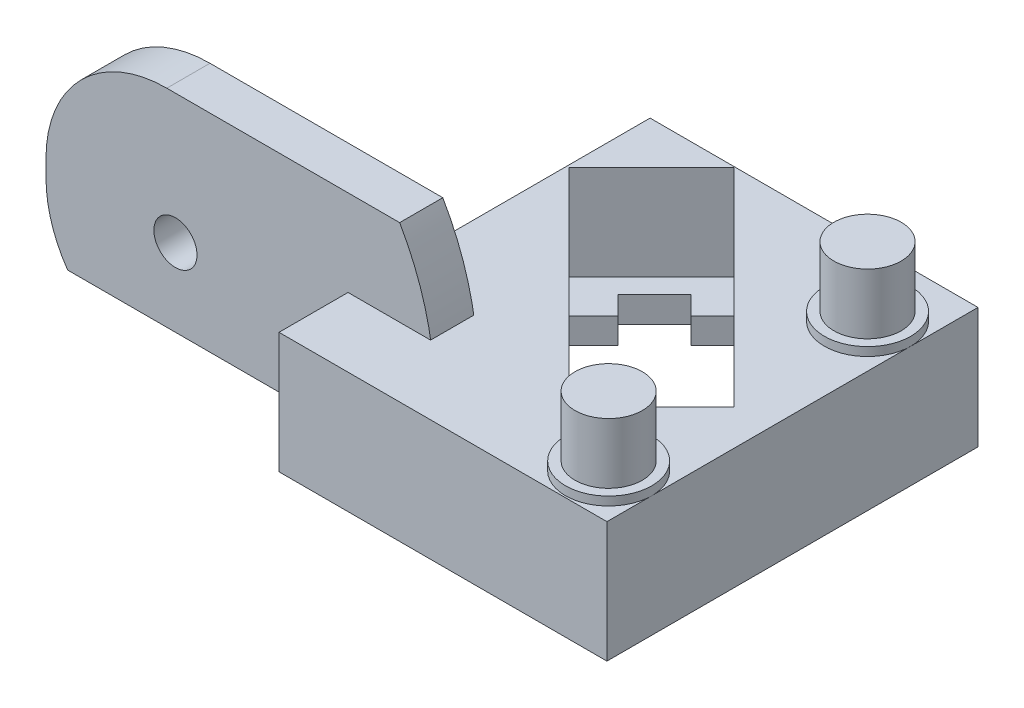
ISO-10303-21;
HEADER;
FILE_DESCRIPTION(('STEP AP214'),'2;1');
FILE_NAME('part.step','',(''),(''),'','','');
FILE_SCHEMA(('AUTOMOTIVE_DESIGN { 1 0 10303 214 1 1 1 1 }'));
ENDSEC;
DATA;
#1=APPLICATION_CONTEXT('core data for automotive mechanical design processes');
#2=APPLICATION_PROTOCOL_DEFINITION('international standard','automotive_design',2000,#1);
#3=PRODUCT_CONTEXT('',#1,'mechanical');
#4=PRODUCT('Part','Part','',(#3));
#5=PRODUCT_RELATED_PRODUCT_CATEGORY('part','',(#4));
#6=PRODUCT_DEFINITION_FORMATION('','',#4);
#7=PRODUCT_DEFINITION_CONTEXT('part definition',#1,'design');
#8=PRODUCT_DEFINITION('design','',#6,#7);
#9=PRODUCT_DEFINITION_SHAPE('','',#8);
#10=(LENGTH_UNIT() NAMED_UNIT(*) SI_UNIT(.MILLI.,.METRE.));
#11=(NAMED_UNIT(*) PLANE_ANGLE_UNIT() SI_UNIT($,.RADIAN.));
#12=(NAMED_UNIT(*) SI_UNIT($,.STERADIAN.) SOLID_ANGLE_UNIT());
#13=UNCERTAINTY_MEASURE_WITH_UNIT(LENGTH_MEASURE(1.E-05),#10,'distance_accuracy_value','');
#14=(GEOMETRIC_REPRESENTATION_CONTEXT(3) GLOBAL_UNCERTAINTY_ASSIGNED_CONTEXT((#13)) GLOBAL_UNIT_ASSIGNED_CONTEXT((#10,
#11,#12)) REPRESENTATION_CONTEXT('',''));
#15=CARTESIAN_POINT('',(0.,0.,0.));
#16=DIRECTION('',(0.,0.,1.));
#17=DIRECTION('',(1.,0.,0.));
#18=AXIS2_PLACEMENT_3D('',#15,#16,#17);
#19=CARTESIAN_POINT('',(0.,0.,5.));
#20=DIRECTION('',(0.,0.,1.));
#21=DIRECTION('',(1.,0.,0.));
#22=AXIS2_PLACEMENT_3D('',#19,#20,#21);
#23=PLANE('',#22);
#24=CARTESIAN_POINT('',(0.,0.,5.));
#25=DIRECTION('',(0.,0.,-1.));
#26=DIRECTION('',(1.,0.,0.));
#27=AXIS2_PLACEMENT_3D('',#24,#25,#26);
#28=CIRCLE('',#27,2.5);
#29=CARTESIAN_POINT('',(-2.5,0.,5.));
#30=VERTEX_POINT('',#29);
#31=EDGE_CURVE('P0_E26',#30,#30,#28,.T.);
#32=ORIENTED_EDGE('',*,*,#31,.T.);
#33=EDGE_LOOP('',(#32));
#34=FACE_BOUND('',#33,.T.);
#35=DIRECTION('',(1.,0.,0.));
#36=VECTOR('',#35,1.);
#37=CARTESIAN_POINT('',(-6.24456275548431,-9.00000013411045,5.));
#38=LINE('',#37,#36);
#39=CARTESIAN_POINT('',(-12.4891255109686,-9.00000013411045,5.));
#40=VERTEX_POINT('',#39);
#41=CARTESIAN_POINT('',(28.6181760003326,-9.00000013411045,5.));
#42=VERTEX_POINT('',#41);
#43=EDGE_CURVE('P0_E171',#40,#42,#38,.T.);
#44=ORIENTED_EDGE('',*,*,#43,.T.);
#45=CARTESIAN_POINT('',(0.,0.,5.));
#46=DIRECTION('',(0.,0.,1.));
#47=DIRECTION('',(1.,0.,0.));
#48=AXIS2_PLACEMENT_3D('',#45,#46,#47);
#49=CIRCLE('',#48,30.);
#50=CARTESIAN_POINT('',(25.9807621135332,15.,5.));
#51=VERTEX_POINT('',#50);
#52=EDGE_CURVE('P0_E92',#42,#51,#49,.T.);
#53=ORIENTED_EDGE('',*,*,#52,.T.);
#54=DIRECTION('',(-1.,0.,0.));
#55=VECTOR('',#54,1.);
#56=CARTESIAN_POINT('',(12.9903810567666,15.,5.));
#57=LINE('',#56,#55);
#58=CARTESIAN_POINT('',(-1.,15.,5.));
#59=VERTEX_POINT('',#58);
#60=EDGE_CURVE('P0_E85',#51,#59,#57,.T.);
#61=ORIENTED_EDGE('',*,*,#60,.T.);
#62=CARTESIAN_POINT('',(-1.,1.,5.));
#63=DIRECTION('',(0.,0.,-1.));
#64=DIRECTION('',(-0.707106781186548,0.707106781186547,0.));
#65=AXIS2_PLACEMENT_3D('',#62,#63,#64);
#66=CIRCLE('',#65,14.);
#67=CARTESIAN_POINT('',(-15.,1.,5.));
#68=VERTEX_POINT('',#67);
#69=EDGE_CURVE('P0_E89',#68,#59,#66,.T.);
#70=ORIENTED_EDGE('',*,*,#69,.F.);
#71=DIRECTION('',(0.,-1.,0.));
#72=VECTOR('',#71,1.);
#73=CARTESIAN_POINT('',(-15.,7.5,5.));
#74=LINE('',#73,#72);
#75=CARTESIAN_POINT('',(-15.,-1.00000044703483,5.));
#76=VERTEX_POINT('',#75);
#77=EDGE_CURVE('P0_E78',#68,#76,#74,.T.);
#78=ORIENTED_EDGE('',*,*,#77,.T.);
#79=CARTESIAN_POINT('',(-1.,-1.00000044703483,5.));
#80=DIRECTION('',(0.,0.,-1.));
#81=DIRECTION('',(-0.707106781186548,-0.707106781186548,0.));
#82=AXIS2_PLACEMENT_3D('',#79,#80,#81);
#83=CIRCLE('',#82,14.);
#84=EDGE_CURVE('P0_E124',#40,#76,#83,.T.);
#85=ORIENTED_EDGE('',*,*,#84,.F.);
#86=EDGE_LOOP('',(#44,#53,#61,#70,#78,#85));
#87=FACE_BOUND('',#86,.T.);
#88=ADVANCED_FACE('P0_F17',(#34,#87),#23,.T.);
#89=CARTESIAN_POINT('',(0.,0.,0.));
#90=DIRECTION('',(0.,0.,1.));
#91=DIRECTION('',(1.,0.,0.));
#92=AXIS2_PLACEMENT_3D('',#89,#90,#91);
#93=CYLINDRICAL_SURFACE('',#92,2.5);
#94=ORIENTED_EDGE('',*,*,#31,.F.);
#95=DIRECTION('',(0.,0.,-1.));
#96=VECTOR('',#95,1.);
#97=CARTESIAN_POINT('',(-2.5,0.,0.));
#98=LINE('',#97,#96);
#99=CARTESIAN_POINT('',(-2.5,0.,0.));
#100=VERTEX_POINT('',#99);
#101=EDGE_CURVE('P0_E11',#30,#100,#98,.T.);
#102=ORIENTED_EDGE('',*,*,#101,.T.);
#103=CARTESIAN_POINT('',(0.,0.,0.));
#104=DIRECTION('',(0.,0.,-1.));
#105=DIRECTION('',(1.,0.,0.));
#106=AXIS2_PLACEMENT_3D('',#103,#104,#105);
#107=CIRCLE('',#106,2.5);
#108=EDGE_CURVE('P0_E125',#100,#100,#107,.T.);
#109=ORIENTED_EDGE('',*,*,#108,.T.);
#110=ORIENTED_EDGE('',*,*,#101,.F.);
#111=EDGE_LOOP('',(#94,#102,#109,#110));
#112=FACE_BOUND('',#111,.T.);
#113=ADVANCED_FACE('P0_F140',(#112),#93,.F.);
#114=CARTESIAN_POINT('',(0.,0.,0.));
#115=DIRECTION('',(0.,0.,1.));
#116=DIRECTION('',(1.,0.,0.));
#117=AXIS2_PLACEMENT_3D('',#114,#115,#116);
#118=CYLINDRICAL_SURFACE('',#117,30.);
#119=DIRECTION('',(0.,0.,-1.));
#120=VECTOR('',#119,1.);
#121=CARTESIAN_POINT('',(28.6181760003326,-9.00000013411045,0.));
#122=LINE('',#121,#120);
#123=CARTESIAN_POINT('',(28.6181760003326,-9.00000013411045,0.));
#124=VERTEX_POINT('',#123);
#125=EDGE_CURVE('P0_E166',#42,#124,#122,.T.);
#126=ORIENTED_EDGE('',*,*,#125,.T.);
#127=CARTESIAN_POINT('',(0.,0.,0.));
#128=DIRECTION('',(0.,0.,1.));
#129=DIRECTION('',(1.,0.,0.));
#130=AXIS2_PLACEMENT_3D('',#127,#128,#129);
#131=CIRCLE('',#130,30.);
#132=CARTESIAN_POINT('',(25.9807621135332,15.,0.));
#133=VERTEX_POINT('',#132);
#134=EDGE_CURVE('P0_E120',#124,#133,#131,.T.);
#135=ORIENTED_EDGE('',*,*,#134,.T.);
#136=DIRECTION('',(0.,0.,1.));
#137=VECTOR('',#136,1.);
#138=CARTESIAN_POINT('',(25.9807621135332,15.,0.));
#139=LINE('',#138,#137);
#140=EDGE_CURVE('P0_E96',#133,#51,#139,.T.);
#141=ORIENTED_EDGE('',*,*,#140,.T.);
#142=ORIENTED_EDGE('',*,*,#52,.F.);
#143=EDGE_LOOP('',(#126,#135,#141,#142));
#144=FACE_BOUND('',#143,.T.);
#145=ADVANCED_FACE('P0_F194',(#144),#118,.T.);
#146=CARTESIAN_POINT('',(-15.,15.,5.));
#147=DIRECTION('',(1.,0.,0.));
#148=DIRECTION('',(0.,1.,0.));
#149=AXIS2_PLACEMENT_3D('',#146,#147,#148);
#150=PLANE('',#149);
#151=DIRECTION('',(0.,0.,-1.));
#152=VECTOR('',#151,1.);
#153=CARTESIAN_POINT('',(-15.,-1.00000044703483,5.));
#154=LINE('',#153,#152);
#155=CARTESIAN_POINT('',(-15.,-1.00000044703483,0.));
#156=VERTEX_POINT('',#155);
#157=EDGE_CURVE('P0_E116',#76,#156,#154,.T.);
#158=ORIENTED_EDGE('',*,*,#157,.F.);
#159=ORIENTED_EDGE('',*,*,#77,.F.);
#160=DIRECTION('',(0.,0.,1.));
#161=VECTOR('',#160,1.);
#162=CARTESIAN_POINT('',(-15.,1.,5.));
#163=LINE('',#162,#161);
#164=CARTESIAN_POINT('',(-15.,1.,0.));
#165=VERTEX_POINT('',#164);
#166=EDGE_CURVE('P0_E109',#165,#68,#163,.T.);
#167=ORIENTED_EDGE('',*,*,#166,.F.);
#168=DIRECTION('',(0.,1.,0.));
#169=VECTOR('',#168,1.);
#170=CARTESIAN_POINT('',(-15.,7.5,0.));
#171=LINE('',#170,#169);
#172=EDGE_CURVE('P0_E177',#156,#165,#171,.T.);
#173=ORIENTED_EDGE('',*,*,#172,.F.);
#174=EDGE_LOOP('',(#158,#159,#167,#173));
#175=FACE_BOUND('',#174,.T.);
#176=ADVANCED_FACE('P0_F219',(#175),#150,.F.);
#177=CARTESIAN_POINT('',(25.9807621135332,15.,5.));
#178=DIRECTION('',(0.,-1.,0.));
#179=DIRECTION('',(0.,0.,-1.));
#180=AXIS2_PLACEMENT_3D('',#177,#178,#179);
#181=PLANE('',#180);
#182=DIRECTION('',(0.,0.,-1.));
#183=VECTOR('',#182,1.);
#184=CARTESIAN_POINT('',(-1.,15.,5.));
#185=LINE('',#184,#183);
#186=CARTESIAN_POINT('',(-1.,15.,0.));
#187=VERTEX_POINT('',#186);
#188=EDGE_CURVE('P0_E97',#59,#187,#185,.T.);
#189=ORIENTED_EDGE('',*,*,#188,.F.);
#190=ORIENTED_EDGE('',*,*,#60,.F.);
#191=ORIENTED_EDGE('',*,*,#140,.F.);
#192=DIRECTION('',(1.,0.,0.));
#193=VECTOR('',#192,1.);
#194=CARTESIAN_POINT('',(12.9903810567666,15.,0.));
#195=LINE('',#194,#193);
#196=EDGE_CURVE('P0_E102',#187,#133,#195,.T.);
#197=ORIENTED_EDGE('',*,*,#196,.F.);
#198=EDGE_LOOP('',(#189,#190,#191,#197));
#199=FACE_BOUND('',#198,.T.);
#200=ADVANCED_FACE('P0_F100',(#199),#181,.F.);
#201=CARTESIAN_POINT('',(-1.,1.,5.));
#202=DIRECTION('',(0.,0.,-1.));
#203=DIRECTION('',(-0.707106781186548,0.707106781186547,0.));
#204=AXIS2_PLACEMENT_3D('',#201,#202,#203);
#205=CYLINDRICAL_SURFACE('',#204,14.);
#206=CARTESIAN_POINT('',(-1.,1.,0.));
#207=DIRECTION('',(0.,0.,1.));
#208=DIRECTION('',(-0.707106781186548,0.707106781186547,0.));
#209=AXIS2_PLACEMENT_3D('',#206,#207,#208);
#210=CIRCLE('',#209,14.);
#211=EDGE_CURVE('P0_E180',#187,#165,#210,.T.);
#212=ORIENTED_EDGE('',*,*,#211,.T.);
#213=ORIENTED_EDGE('',*,*,#166,.T.);
#214=ORIENTED_EDGE('',*,*,#69,.T.);
#215=ORIENTED_EDGE('',*,*,#188,.T.);
#216=EDGE_LOOP('',(#212,#213,#214,#215));
#217=FACE_BOUND('',#216,.T.);
#218=ADVANCED_FACE('P0_F108',(#217),#205,.T.);
#219=CARTESIAN_POINT('',(-1.,-1.00000044703483,5.));
#220=DIRECTION('',(0.,0.,-1.));
#221=DIRECTION('',(-0.707106781186548,-0.707106781186548,0.));
#222=AXIS2_PLACEMENT_3D('',#219,#220,#221);
#223=CYLINDRICAL_SURFACE('',#222,14.);
#224=DIRECTION('',(0.,0.,1.));
#225=VECTOR('',#224,1.);
#226=CARTESIAN_POINT('',(-12.4891255109686,-9.00000013411045,5.));
#227=LINE('',#226,#225);
#228=CARTESIAN_POINT('',(-12.4891255109686,-9.00000013411045,0.));
#229=VERTEX_POINT('',#228);
#230=EDGE_CURVE('P0_E176',#229,#40,#227,.T.);
#231=ORIENTED_EDGE('',*,*,#230,.T.);
#232=ORIENTED_EDGE('',*,*,#84,.T.);
#233=ORIENTED_EDGE('',*,*,#157,.T.);
#234=CARTESIAN_POINT('',(-1.,-1.00000044703483,0.));
#235=DIRECTION('',(0.,0.,1.));
#236=DIRECTION('',(-0.707106781186548,-0.707106781186548,0.));
#237=AXIS2_PLACEMENT_3D('',#234,#235,#236);
#238=CIRCLE('',#237,14.);
#239=EDGE_CURVE('P0_E157',#156,#229,#238,.T.);
#240=ORIENTED_EDGE('',*,*,#239,.T.);
#241=EDGE_LOOP('',(#231,#232,#233,#240));
#242=FACE_BOUND('',#241,.T.);
#243=ADVANCED_FACE('P0_F147',(#242),#223,.T.);
#244=CARTESIAN_POINT('',(0.,0.,0.));
#245=DIRECTION('',(0.,0.,1.));
#246=DIRECTION('',(1.,0.,0.));
#247=AXIS2_PLACEMENT_3D('',#244,#245,#246);
#248=PLANE('',#247);
#249=ORIENTED_EDGE('',*,*,#108,.F.);
#250=EDGE_LOOP('',(#249));
#251=FACE_BOUND('',#250,.T.);
#252=DIRECTION('',(-1.,0.,0.));
#253=VECTOR('',#252,1.);
#254=CARTESIAN_POINT('',(-6.24456275548431,-9.00000013411045,0.));
#255=LINE('',#254,#253);
#256=EDGE_CURVE('P0_E154',#124,#229,#255,.T.);
#257=ORIENTED_EDGE('',*,*,#256,.T.);
#258=ORIENTED_EDGE('',*,*,#239,.F.);
#259=ORIENTED_EDGE('',*,*,#172,.T.);
#260=ORIENTED_EDGE('',*,*,#211,.F.);
#261=ORIENTED_EDGE('',*,*,#196,.T.);
#262=ORIENTED_EDGE('',*,*,#134,.F.);
#263=EDGE_LOOP('',(#257,#258,#259,#260,#261,#262));
#264=FACE_BOUND('',#263,.T.);
#265=ADVANCED_FACE('P0_F143',(#251,#264),#248,.F.);
#266=CARTESIAN_POINT('',(-12.4891255109686,-9.00000013411045,5.));
#267=DIRECTION('',(0.,1.,0.));
#268=DIRECTION('',(1.,0.,0.));
#269=AXIS2_PLACEMENT_3D('',#266,#267,#268);
#270=PLANE('',#269);
#271=ORIENTED_EDGE('',*,*,#256,.F.);
#272=ORIENTED_EDGE('',*,*,#125,.F.);
#273=ORIENTED_EDGE('',*,*,#43,.F.);
#274=ORIENTED_EDGE('',*,*,#230,.F.);
#275=EDGE_LOOP('',(#271,#272,#273,#274));
#276=FACE_BOUND('',#275,.T.);
#277=ADVANCED_FACE('P0_F146',(#276),#270,.F.);
#278=CLOSED_SHELL('',(#88,#113,#145,#176,#200,#218,#243,#265,#277));
#279=MANIFOLD_SOLID_BREP('P0_B1',#278);
#280=CARTESIAN_POINT('',(20.,-2.,-8.5));
#281=DIRECTION('',(1.,0.,0.));
#282=DIRECTION('',(0.,1.,0.));
#283=AXIS2_PLACEMENT_3D('',#280,#281,#282);
#284=PLANE('',#283);
#285=DIRECTION('',(0.,0.,1.));
#286=VECTOR('',#285,1.);
#287=CARTESIAN_POINT('',(20.,5.,5.));
#288=LINE('',#287,#286);
#289=CARTESIAN_POINT('',(20.,5.,-30.));
#290=VERTEX_POINT('',#289);
#291=CARTESIAN_POINT('',(20.,5.,13.));
#292=VERTEX_POINT('',#291);
#293=EDGE_CURVE('P1_E221',#290,#292,#288,.T.);
#294=ORIENTED_EDGE('',*,*,#293,.F.);
#295=DIRECTION('',(0.,-1.,0.));
#296=VECTOR('',#295,1.);
#297=CARTESIAN_POINT('',(20.,5.,-30.));
#298=LINE('',#297,#296);
#299=CARTESIAN_POINT('',(20.,-9.,-30.));
#300=VERTEX_POINT('',#299);
#301=EDGE_CURVE('P1_E318',#290,#300,#298,.T.);
#302=ORIENTED_EDGE('',*,*,#301,.T.);
#303=DIRECTION('',(0.,0.,-1.));
#304=VECTOR('',#303,1.);
#305=CARTESIAN_POINT('',(20.,-9.,13.));
#306=LINE('',#305,#304);
#307=CARTESIAN_POINT('',(20.,-9.,13.));
#308=VERTEX_POINT('',#307);
#309=EDGE_CURVE('P1_E324',#308,#300,#306,.T.);
#310=ORIENTED_EDGE('',*,*,#309,.F.);
#311=DIRECTION('',(0.,-1.,0.));
#312=VECTOR('',#311,1.);
#313=CARTESIAN_POINT('',(20.,5.,13.));
#314=LINE('',#313,#312);
#315=EDGE_CURVE('P1_E19',#292,#308,#314,.T.);
#316=ORIENTED_EDGE('',*,*,#315,.F.);
#317=EDGE_LOOP('',(#294,#302,#310,#316));
#318=FACE_BOUND('',#317,.T.);
#319=ADVANCED_FACE('P1_F16',(#318),#284,.F.);
#320=CARTESIAN_POINT('',(58.,-2.,-8.5));
#321=DIRECTION('',(1.,0.,0.));
#322=DIRECTION('',(0.,1.,0.));
#323=AXIS2_PLACEMENT_3D('',#320,#321,#322);
#324=PLANE('',#323);
#325=DIRECTION('',(0.,0.,1.));
#326=VECTOR('',#325,1.);
#327=CARTESIAN_POINT('',(58.,5.,5.));
#328=LINE('',#327,#326);
#329=CARTESIAN_POINT('',(58.,5.,-30.));
#330=VERTEX_POINT('',#329);
#331=CARTESIAN_POINT('',(58.,5.,-22.2));
#332=VERTEX_POINT('',#331);
#333=EDGE_CURVE('P1_E213',#330,#332,#328,.T.);
#334=ORIENTED_EDGE('',*,*,#333,.T.);
#335=DIRECTION('',(0.,0.,1.));
#336=VECTOR('',#335,1.);
#337=CARTESIAN_POINT('',(58.,5.,5.));
#338=LINE('',#337,#336);
#339=CARTESIAN_POINT('',(58.,5.,13.));
#340=VERTEX_POINT('',#339);
#341=EDGE_CURVE('P1_E210',#332,#340,#338,.T.);
#342=ORIENTED_EDGE('',*,*,#341,.T.);
#343=DIRECTION('',(0.,-1.,0.));
#344=VECTOR('',#343,1.);
#345=CARTESIAN_POINT('',(58.,5.,13.));
#346=LINE('',#345,#344);
#347=CARTESIAN_POINT('',(58.,-9.,13.));
#348=VERTEX_POINT('',#347);
#349=EDGE_CURVE('P1_E10',#340,#348,#346,.T.);
#350=ORIENTED_EDGE('',*,*,#349,.T.);
#351=DIRECTION('',(0.,0.,-1.));
#352=VECTOR('',#351,1.);
#353=CARTESIAN_POINT('',(58.,-9.,13.));
#354=LINE('',#353,#352);
#355=CARTESIAN_POINT('',(58.,-9.,-30.));
#356=VERTEX_POINT('',#355);
#357=EDGE_CURVE('P1_E332',#348,#356,#354,.T.);
#358=ORIENTED_EDGE('',*,*,#357,.T.);
#359=DIRECTION('',(0.,1.,0.));
#360=VECTOR('',#359,1.);
#361=CARTESIAN_POINT('',(58.,5.,-30.));
#362=LINE('',#361,#360);
#363=EDGE_CURVE('P1_E321',#356,#330,#362,.T.);
#364=ORIENTED_EDGE('',*,*,#363,.T.);
#365=EDGE_LOOP('',(#334,#342,#350,#358,#364));
#366=FACE_BOUND('',#365,.T.);
#367=ADVANCED_FACE('P1_F211',(#366),#324,.T.);
#368=CARTESIAN_POINT('',(20.,5.,13.));
#369=DIRECTION('',(0.,0.,1.));
#370=DIRECTION('',(1.,0.,0.));
#371=AXIS2_PLACEMENT_3D('',#368,#369,#370);
#372=PLANE('',#371);
#373=ORIENTED_EDGE('',*,*,#315,.T.);
#374=DIRECTION('',(1.,0.,0.));
#375=VECTOR('',#374,1.);
#376=CARTESIAN_POINT('',(20.,-9.,13.));
#377=LINE('',#376,#375);
#378=EDGE_CURVE('P1_E205',#308,#348,#377,.T.);
#379=ORIENTED_EDGE('',*,*,#378,.T.);
#380=ORIENTED_EDGE('',*,*,#349,.F.);
#381=DIRECTION('',(1.,0.,0.));
#382=VECTOR('',#381,1.);
#383=CARTESIAN_POINT('',(20.,5.,13.));
#384=LINE('',#383,#382);
#385=EDGE_CURVE('P1_E202',#292,#340,#384,.T.);
#386=ORIENTED_EDGE('',*,*,#385,.F.);
#387=EDGE_LOOP('',(#373,#379,#380,#386));
#388=FACE_BOUND('',#387,.T.);
#389=ADVANCED_FACE('P1_F200',(#388),#372,.T.);
#390=CARTESIAN_POINT('',(20.,-9.,-30.));
#391=DIRECTION('',(0.,0.,-1.));
#392=DIRECTION('',(0.,-1.,0.));
#393=AXIS2_PLACEMENT_3D('',#390,#391,#392);
#394=PLANE('',#393);
#395=ORIENTED_EDGE('',*,*,#301,.F.);
#396=DIRECTION('',(1.,0.,0.));
#397=VECTOR('',#396,1.);
#398=CARTESIAN_POINT('',(20.,5.,-30.));
#399=LINE('',#398,#397);
#400=EDGE_CURVE('P1_E236',#290,#330,#399,.T.);
#401=ORIENTED_EDGE('',*,*,#400,.T.);
#402=ORIENTED_EDGE('',*,*,#363,.F.);
#403=DIRECTION('',(1.,0.,0.));
#404=VECTOR('',#403,1.);
#405=CARTESIAN_POINT('',(20.,-9.,-30.));
#406=LINE('',#405,#404);
#407=EDGE_CURVE('P1_E328',#300,#356,#406,.T.);
#408=ORIENTED_EDGE('',*,*,#407,.F.);
#409=EDGE_LOOP('',(#395,#401,#402,#408));
#410=FACE_BOUND('',#409,.T.);
#411=ADVANCED_FACE('P1_F385',(#410),#394,.T.);
#412=CARTESIAN_POINT('',(53.8492424049175,5.,-5.86648634762061));
#413=DIRECTION('',(0.707106781186548,0.,0.707106781186547));
#414=DIRECTION('',(0.,-1.,0.));
#415=AXIS2_PLACEMENT_3D('',#412,#413,#414);
#416=PLANE('',#415);
#417=DIRECTION('',(-0.707106781186547,0.,0.707106781186548));
#418=VECTOR('',#417,1.);
#419=CARTESIAN_POINT('',(51.420310216783,5.,-3.43755415948608));
#420=LINE('',#419,#418);
#421=CARTESIAN_POINT('',(53.8492424049175,5.,-5.86648634762061));
#422=VERTEX_POINT('',#421);
#423=CARTESIAN_POINT('',(44.3033008588991,5.,3.67945519839781));
#424=VERTEX_POINT('',#423);
#425=EDGE_CURVE('P1_E235',#422,#424,#420,.T.);
#426=ORIENTED_EDGE('',*,*,#425,.F.);
#427=DIRECTION('',(0.,-1.,0.));
#428=VECTOR('',#427,1.);
#429=CARTESIAN_POINT('',(53.8492424049175,5.,-5.86648634762061));
#430=LINE('',#429,#428);
#431=CARTESIAN_POINT('',(53.8492424049175,-6.,-5.86648634762061));
#432=VERTEX_POINT('',#431);
#433=EDGE_CURVE('P1_E268',#422,#432,#430,.T.);
#434=ORIENTED_EDGE('',*,*,#433,.T.);
#435=DIRECTION('',(-0.707106781186547,0.,0.707106781186548));
#436=VECTOR('',#435,1.);
#437=CARTESIAN_POINT('',(53.8492424049175,-6.,-5.86648634762061));
#438=LINE('',#437,#436);
#439=CARTESIAN_POINT('',(44.3033008588991,-6.,3.67945519839781));
#440=VERTEX_POINT('',#439);
#441=EDGE_CURVE('P1_E313',#432,#440,#438,.T.);
#442=ORIENTED_EDGE('',*,*,#441,.T.);
#443=DIRECTION('',(0.,-1.,0.));
#444=VECTOR('',#443,1.);
#445=CARTESIAN_POINT('',(44.3033008588991,5.,3.67945519839781));
#446=LINE('',#445,#444);
#447=EDGE_CURVE('P1_E267',#424,#440,#446,.T.);
#448=ORIENTED_EDGE('',*,*,#447,.F.);
#449=EDGE_LOOP('',(#426,#434,#442,#448));
#450=FACE_BOUND('',#449,.T.);
#451=ADVANCED_FACE('P1_F703',(#450),#416,.F.);
#452=CARTESIAN_POINT('',(44.3033008588991,5.,3.67945519839781));
#453=DIRECTION('',(-0.707106781186547,0.,0.707106781186548));
#454=DIRECTION('',(0.,1.,0.));
#455=AXIS2_PLACEMENT_3D('',#452,#453,#454);
#456=PLANE('',#455);
#457=DIRECTION('',(-0.707106781186548,0.,-0.707106781186547));
#458=VECTOR('',#457,1.);
#459=CARTESIAN_POINT('',(29.8076118445749,5.,-10.8162338159264));
#460=LINE('',#459,#458);
#461=CARTESIAN_POINT('',(20.2616702985565,5.,-20.3621753619448));
#462=VERTEX_POINT('',#461);
#463=EDGE_CURVE('P1_E239',#424,#462,#460,.T.);
#464=ORIENTED_EDGE('',*,*,#463,.F.);
#465=ORIENTED_EDGE('',*,*,#447,.T.);
#466=DIRECTION('',(-0.707106781186548,0.,-0.707106781186547));
#467=VECTOR('',#466,1.);
#468=CARTESIAN_POINT('',(44.3033008588991,-6.,3.67945519839781));
#469=LINE('',#468,#467);
#470=CARTESIAN_POINT('',(40.4142135623731,-6.,-0.209632098128192));
#471=VERTEX_POINT('',#470);
#472=EDGE_CURVE('P1_E310',#440,#471,#469,.T.);
#473=ORIENTED_EDGE('',*,*,#472,.T.);
#474=DIRECTION('',(0.,-1.,0.));
#475=VECTOR('',#474,1.);
#476=CARTESIAN_POINT('',(40.4142135623731,-6.,-0.209632098128192));
#477=LINE('',#476,#475);
#478=CARTESIAN_POINT('',(40.4142135623731,-9.,-0.209632098128192));
#479=VERTEX_POINT('',#478);
#480=EDGE_CURVE('P1_E274',#471,#479,#477,.T.);
#481=ORIENTED_EDGE('',*,*,#480,.T.);
#482=DIRECTION('',(0.707106781186548,0.,0.707106781186547));
#483=VECTOR('',#482,1.);
#484=CARTESIAN_POINT('',(38.6130681963119,-9.,-2.01077746418943));
#485=LINE('',#484,#483);
#486=CARTESIAN_POINT('',(24.1507575950825,-9.,-16.4730880654188));
#487=VERTEX_POINT('',#486);
#488=EDGE_CURVE('P1_E301',#487,#479,#485,.T.);
#489=ORIENTED_EDGE('',*,*,#488,.F.);
#490=DIRECTION('',(0.,-1.,0.));
#491=VECTOR('',#490,1.);
#492=CARTESIAN_POINT('',(24.1507575950825,-6.,-16.4730880654188));
#493=LINE('',#492,#491);
#494=CARTESIAN_POINT('',(24.1507575950825,-6.,-16.4730880654188));
#495=VERTEX_POINT('',#494);
#496=EDGE_CURVE('P1_E346',#495,#487,#493,.T.);
#497=ORIENTED_EDGE('',*,*,#496,.F.);
#498=DIRECTION('',(-0.707106781186548,0.,-0.707106781186547));
#499=VECTOR('',#498,1.);
#500=CARTESIAN_POINT('',(44.3033008588991,-6.,3.67945519839781));
#501=LINE('',#500,#499);
#502=CARTESIAN_POINT('',(20.2616702985565,-6.,-20.3621753619448));
#503=VERTEX_POINT('',#502);
#504=EDGE_CURVE('P1_E252',#495,#503,#501,.T.);
#505=ORIENTED_EDGE('',*,*,#504,.T.);
#506=DIRECTION('',(0.,-1.,0.));
#507=VECTOR('',#506,1.);
#508=CARTESIAN_POINT('',(20.2616702985565,5.,-20.3621753619448));
#509=LINE('',#508,#507);
#510=EDGE_CURVE('P1_E37',#462,#503,#509,.T.);
#511=ORIENTED_EDGE('',*,*,#510,.F.);
#512=EDGE_LOOP('',(#464,#465,#473,#481,#489,#497,#505,#511));
#513=FACE_BOUND('',#512,.T.);
#514=ADVANCED_FACE('P1_F706',(#513),#456,.F.);
#515=CARTESIAN_POINT('',(20.2616702985565,5.,-20.3621753619448));
#516=DIRECTION('',(-0.707106781186547,0.,-0.707106781186548));
#517=DIRECTION('',(-0.707106781186548,0.,0.707106781186547));
#518=AXIS2_PLACEMENT_3D('',#515,#516,#517);
#519=PLANE('',#518);
#520=DIRECTION('',(0.707106781186548,0.,-0.707106781186547));
#521=VECTOR('',#520,1.);
#522=CARTESIAN_POINT('',(22.6057088834312,5.,-22.7062139468195));
#523=LINE('',#522,#521);
#524=CARTESIAN_POINT('',(29.8076118445749,5.,-29.9081169079632));
#525=VERTEX_POINT('',#524);
#526=EDGE_CURVE('P1_E244',#462,#525,#523,.T.);
#527=ORIENTED_EDGE('',*,*,#526,.F.);
#528=ORIENTED_EDGE('',*,*,#510,.T.);
#529=DIRECTION('',(0.707106781186548,0.,-0.707106781186547));
#530=VECTOR('',#529,1.);
#531=CARTESIAN_POINT('',(20.2616702985565,-6.,-20.3621753619448));
#532=LINE('',#531,#530);
#533=CARTESIAN_POINT('',(29.8076118445749,-6.,-29.9081169079632));
#534=VERTEX_POINT('',#533);
#535=EDGE_CURVE('P1_E249',#503,#534,#532,.T.);
#536=ORIENTED_EDGE('',*,*,#535,.T.);
#537=DIRECTION('',(0.,-1.,0.));
#538=VECTOR('',#537,1.);
#539=CARTESIAN_POINT('',(29.8076118445749,5.,-29.9081169079632));
#540=LINE('',#539,#538);
#541=EDGE_CURVE('P1_E47',#525,#534,#540,.T.);
#542=ORIENTED_EDGE('',*,*,#541,.F.);
#543=EDGE_LOOP('',(#527,#528,#536,#542));
#544=FACE_BOUND('',#543,.T.);
#545=ADVANCED_FACE('P1_F710',(#544),#519,.F.);
#546=CARTESIAN_POINT('',(29.8076118445749,5.,-29.9081169079632));
#547=DIRECTION('',(0.707106781186547,0.,-0.707106781186548));
#548=DIRECTION('',(0.,-1.,0.));
#549=AXIS2_PLACEMENT_3D('',#546,#547,#548);
#550=PLANE('',#549);
#551=DIRECTION('',(0.707106781186548,0.,0.707106781186547));
#552=VECTOR('',#551,1.);
#553=CARTESIAN_POINT('',(27.332738110422,5.,-32.3829906421161));
#554=LINE('',#553,#552);
#555=EDGE_CURVE('P1_E231',#525,#422,#554,.T.);
#556=ORIENTED_EDGE('',*,*,#555,.F.);
#557=ORIENTED_EDGE('',*,*,#541,.T.);
#558=DIRECTION('',(0.707106781186548,0.,0.707106781186547));
#559=VECTOR('',#558,1.);
#560=CARTESIAN_POINT('',(29.8076118445749,-6.,-29.9081169079632));
#561=LINE('',#560,#559);
#562=CARTESIAN_POINT('',(33.6966991411009,-6.,-26.0190296114372));
#563=VERTEX_POINT('',#562);
#564=EDGE_CURVE('P1_E253',#534,#563,#561,.T.);
#565=ORIENTED_EDGE('',*,*,#564,.T.);
#566=DIRECTION('',(0.,-1.,0.));
#567=VECTOR('',#566,1.);
#568=CARTESIAN_POINT('',(33.6966991411009,-6.,-26.0190296114372));
#569=LINE('',#568,#567);
#570=CARTESIAN_POINT('',(33.6966991411009,-9.,-26.0190296114372));
#571=VERTEX_POINT('',#570);
#572=EDGE_CURVE('P1_E277',#563,#571,#569,.T.);
#573=ORIENTED_EDGE('',*,*,#572,.T.);
#574=DIRECTION('',(-0.707106781186548,0.,-0.707106781186547));
#575=VECTOR('',#574,1.);
#576=CARTESIAN_POINT('',(40.027281758685,-9.,-19.6884469938531));
#577=LINE('',#576,#575);
#578=CARTESIAN_POINT('',(49.9601551083915,-9.,-9.75557364414661));
#579=VERTEX_POINT('',#578);
#580=EDGE_CURVE('P1_E287',#579,#571,#577,.T.);
#581=ORIENTED_EDGE('',*,*,#580,.F.);
#582=DIRECTION('',(0.,-1.,0.));
#583=VECTOR('',#582,1.);
#584=CARTESIAN_POINT('',(49.9601551083915,-6.,-9.75557364414661));
#585=LINE('',#584,#583);
#586=CARTESIAN_POINT('',(49.9601551083915,-6.,-9.75557364414661));
#587=VERTEX_POINT('',#586);
#588=EDGE_CURVE('P1_E278',#587,#579,#585,.T.);
#589=ORIENTED_EDGE('',*,*,#588,.F.);
#590=DIRECTION('',(0.707106781186548,0.,0.707106781186547));
#591=VECTOR('',#590,1.);
#592=CARTESIAN_POINT('',(29.8076118445749,-6.,-29.9081169079632));
#593=LINE('',#592,#591);
#594=EDGE_CURVE('P1_E363',#587,#432,#593,.T.);
#595=ORIENTED_EDGE('',*,*,#594,.T.);
#596=ORIENTED_EDGE('',*,*,#433,.F.);
#597=EDGE_LOOP('',(#556,#557,#565,#573,#581,#589,#595,#596));
#598=FACE_BOUND('',#597,.T.);
#599=ADVANCED_FACE('P1_F455',(#598),#550,.F.);
#600=CARTESIAN_POINT('',(37.055456351737,-6.,-13.1143308547827));
#601=DIRECTION('',(0.,-1.,0.));
#602=DIRECTION('',(0.,0.,-1.));
#603=AXIS2_PLACEMENT_3D('',#600,#601,#602);
#604=PLANE('',#603);
#605=DIRECTION('',(0.707106781186548,0.,0.707106781186548));
#606=VECTOR('',#605,1.);
#607=CARTESIAN_POINT('',(34.2270292269908,-6.,-20.5389520572415));
#608=LINE('',#607,#606);
#609=CARTESIAN_POINT('',(29.1005050633884,-6.,-25.6654762208439));
#610=VERTEX_POINT('',#609);
#611=CARTESIAN_POINT('',(31.221825406948,-6.,-23.5441558772843));
#612=VERTEX_POINT('',#611);
#613=EDGE_CURVE('P1_E282',#610,#612,#608,.T.);
#614=ORIENTED_EDGE('',*,*,#613,.T.);
#615=DIRECTION('',(0.707106781186547,0.,-0.707106781186548));
#616=VECTOR('',#615,1.);
#617=CARTESIAN_POINT('',(26.5372429815871,-6.,-18.8595734519234));
#618=LINE('',#617,#616);
#619=EDGE_CURVE('P1_E314',#612,#563,#618,.T.);
#620=ORIENTED_EDGE('',*,*,#619,.T.);
#621=ORIENTED_EDGE('',*,*,#564,.F.);
#622=ORIENTED_EDGE('',*,*,#535,.F.);
#623=ORIENTED_EDGE('',*,*,#504,.F.);
#624=DIRECTION('',(0.707106781186547,0.,-0.707106781186548));
#625=VECTOR('',#624,1.);
#626=CARTESIAN_POINT('',(26.5372429815871,-6.,-18.8595734519234));
#627=LINE('',#626,#625);
#628=CARTESIAN_POINT('',(26.9791847198287,-6.,-19.301515190165));
#629=VERTEX_POINT('',#628);
#630=EDGE_CURVE('P1_E345',#495,#629,#627,.T.);
#631=ORIENTED_EDGE('',*,*,#630,.T.);
#632=DIRECTION('',(-0.707106781186548,0.,-0.707106781186548));
#633=VECTOR('',#632,1.);
#634=CARTESIAN_POINT('',(31.0450487116514,-6.,-15.2356511983423));
#635=LINE('',#634,#633);
#636=CARTESIAN_POINT('',(24.8578643762691,-6.,-21.4228355337246));
#637=VERTEX_POINT('',#636);
#638=EDGE_CURVE('P1_E260',#629,#637,#635,.T.);
#639=ORIENTED_EDGE('',*,*,#638,.T.);
#640=DIRECTION('',(0.707106781186548,0.,-0.707106781186548));
#641=VECTOR('',#640,1.);
#642=CARTESIAN_POINT('',(25.8301362004006,-6.,-22.3951073578561));
#643=LINE('',#642,#641);
#644=EDGE_CURVE('P1_E309',#637,#610,#643,.T.);
#645=ORIENTED_EDGE('',*,*,#644,.T.);
#646=EDGE_LOOP('',(#614,#620,#621,#622,#623,#631,#639,#645));
#647=FACE_BOUND('',#646,.T.);
#648=ADVANCED_FACE('P1_F428',(#647),#604,.F.);
#649=CARTESIAN_POINT('',(37.055456351737,-6.,-13.1143308547827));
#650=DIRECTION('',(0.,-1.,0.));
#651=DIRECTION('',(0.,0.,-1.));
#652=AXIS2_PLACEMENT_3D('',#649,#650,#651);
#653=PLANE('',#652);
#654=DIRECTION('',(-0.707106781186547,0.,0.707106781186548));
#655=VECTOR('',#654,1.);
#656=CARTESIAN_POINT('',(47.5736697218869,-6.,-7.369088257642));
#657=LINE('',#656,#655);
#658=EDGE_CURVE('P1_E349',#587,#471,#657,.T.);
#659=ORIENTED_EDGE('',*,*,#658,.T.);
#660=ORIENTED_EDGE('',*,*,#472,.F.);
#661=ORIENTED_EDGE('',*,*,#441,.F.);
#662=ORIENTED_EDGE('',*,*,#594,.F.);
#663=EDGE_LOOP('',(#659,#660,#661,#662));
#664=FACE_BOUND('',#663,.T.);
#665=ADVANCED_FACE('P1_F718',(#664),#653,.F.);
#666=CARTESIAN_POINT('',(24.1507575950825,-6.,-16.4730880654188));
#667=DIRECTION('',(-0.707106781186548,0.,-0.707106781186547));
#668=DIRECTION('',(-0.707106781186547,0.,0.707106781186548));
#669=AXIS2_PLACEMENT_3D('',#666,#667,#668);
#670=PLANE('',#669);
#671=DIRECTION('',(0.,-1.,0.));
#672=VECTOR('',#671,1.);
#673=CARTESIAN_POINT('',(31.221825406948,-6.,-23.5441558772843));
#674=LINE('',#673,#672);
#675=CARTESIAN_POINT('',(31.221825406948,-9.,-23.5441558772843));
#676=VERTEX_POINT('',#675);
#677=EDGE_CURVE('P1_E305',#612,#676,#674,.T.);
#678=ORIENTED_EDGE('',*,*,#677,.T.);
#679=DIRECTION('',(-0.707106781186547,0.,0.707106781186548));
#680=VECTOR('',#679,1.);
#681=CARTESIAN_POINT('',(15.7447961799572,-9.,-8.06712665029345));
#682=LINE('',#681,#680);
#683=EDGE_CURVE('P1_E291',#571,#676,#682,.T.);
#684=ORIENTED_EDGE('',*,*,#683,.F.);
#685=ORIENTED_EDGE('',*,*,#572,.F.);
#686=ORIENTED_EDGE('',*,*,#619,.F.);
#687=EDGE_LOOP('',(#678,#684,#685,#686));
#688=FACE_BOUND('',#687,.T.);
#689=ADVANCED_FACE('P1_F453',(#688),#670,.F.);
#690=CARTESIAN_POINT('',(49.9601551083915,-6.,-9.75557364414661));
#691=DIRECTION('',(0.707106781186548,0.,0.707106781186547));
#692=DIRECTION('',(0.,-1.,0.));
#693=AXIS2_PLACEMENT_3D('',#690,#691,#692);
#694=PLANE('',#693);
#695=ORIENTED_EDGE('',*,*,#658,.F.);
#696=ORIENTED_EDGE('',*,*,#588,.T.);
#697=DIRECTION('',(0.707106781186547,0.,-0.707106781186548));
#698=VECTOR('',#697,1.);
#699=CARTESIAN_POINT('',(36.781222920257,-9.,3.42335854398793));
#700=LINE('',#699,#698);
#701=EDGE_CURVE('P1_E292',#479,#579,#700,.T.);
#702=ORIENTED_EDGE('',*,*,#701,.F.);
#703=ORIENTED_EDGE('',*,*,#480,.F.);
#704=EDGE_LOOP('',(#695,#696,#702,#703));
#705=FACE_BOUND('',#704,.T.);
#706=ADVANCED_FACE('P1_F724',(#705),#694,.F.);
#707=CARTESIAN_POINT('',(24.1507575950825,-6.,-16.4730880654188));
#708=DIRECTION('',(-0.707106781186548,0.,-0.707106781186547));
#709=DIRECTION('',(-0.707106781186547,0.,0.707106781186548));
#710=AXIS2_PLACEMENT_3D('',#707,#708,#709);
#711=PLANE('',#710);
#712=DIRECTION('',(0.,1.,0.));
#713=VECTOR('',#712,1.);
#714=CARTESIAN_POINT('',(26.9791847198287,-6.,-19.301515190165));
#715=LINE('',#714,#713);
#716=CARTESIAN_POINT('',(26.9791847198287,-9.,-19.301515190165));
#717=VERTEX_POINT('',#716);
#718=EDGE_CURVE('P1_E264',#717,#629,#715,.T.);
#719=ORIENTED_EDGE('',*,*,#718,.T.);
#720=ORIENTED_EDGE('',*,*,#630,.F.);
#721=ORIENTED_EDGE('',*,*,#496,.T.);
#722=DIRECTION('',(-0.707106781186547,0.,0.707106781186548));
#723=VECTOR('',#722,1.);
#724=CARTESIAN_POINT('',(15.7447961799572,-9.,-8.06712665029345));
#725=LINE('',#724,#723);
#726=EDGE_CURVE('P1_E297',#717,#487,#725,.T.);
#727=ORIENTED_EDGE('',*,*,#726,.F.);
#728=EDGE_LOOP('',(#719,#720,#721,#727));
#729=FACE_BOUND('',#728,.T.);
#730=ADVANCED_FACE('P1_F434',(#729),#711,.F.);
#731=CARTESIAN_POINT('',(20.,-9.,13.));
#732=DIRECTION('',(0.,-1.,0.));
#733=DIRECTION('',(0.,0.,-1.));
#734=AXIS2_PLACEMENT_3D('',#731,#732,#733);
#735=PLANE('',#734);
#736=DIRECTION('',(-0.707106781186548,0.,-0.707106781186548));
#737=VECTOR('',#736,1.);
#738=CARTESIAN_POINT('',(36.4917478527522,-9.,-18.27423343148));
#739=LINE('',#738,#737);
#740=CARTESIAN_POINT('',(29.1005050633884,-9.,-25.6654762208439));
#741=VERTEX_POINT('',#740);
#742=EDGE_CURVE('P1_E296',#676,#741,#739,.T.);
#743=ORIENTED_EDGE('',*,*,#742,.T.);
#744=DIRECTION('',(-0.707106781186548,0.,0.707106781186548));
#745=VECTOR('',#744,1.);
#746=CARTESIAN_POINT('',(15.0376893987706,-9.,-11.6026605562262));
#747=LINE('',#746,#745);
#748=CARTESIAN_POINT('',(24.8578643762691,-9.,-21.4228355337246));
#749=VERTEX_POINT('',#748);
#750=EDGE_CURVE('P1_E317',#741,#749,#747,.T.);
#751=ORIENTED_EDGE('',*,*,#750,.T.);
#752=DIRECTION('',(0.707106781186548,0.,0.707106781186548));
#753=VECTOR('',#752,1.);
#754=CARTESIAN_POINT('',(33.3097673374128,-9.,-12.9709325725809));
#755=LINE('',#754,#753);
#756=EDGE_CURVE('P1_E269',#749,#717,#755,.T.);
#757=ORIENTED_EDGE('',*,*,#756,.T.);
#758=ORIENTED_EDGE('',*,*,#726,.T.);
#759=ORIENTED_EDGE('',*,*,#488,.T.);
#760=ORIENTED_EDGE('',*,*,#701,.T.);
#761=ORIENTED_EDGE('',*,*,#580,.T.);
#762=ORIENTED_EDGE('',*,*,#683,.T.);
#763=EDGE_LOOP('',(#743,#751,#757,#758,#759,#760,#761,#762));
#764=FACE_BOUND('',#763,.T.);
#765=ORIENTED_EDGE('',*,*,#309,.T.);
#766=ORIENTED_EDGE('',*,*,#407,.T.);
#767=ORIENTED_EDGE('',*,*,#357,.F.);
#768=ORIENTED_EDGE('',*,*,#378,.F.);
#769=EDGE_LOOP('',(#765,#766,#767,#768));
#770=FACE_BOUND('',#769,.T.);
#771=ADVANCED_FACE('P1_F382',(#764,#770),#735,.T.);
#772=CARTESIAN_POINT('',(24.8578643762691,-6.,-21.4228355337246));
#773=DIRECTION('',(-0.707106781186548,0.,-0.707106781186548));
#774=DIRECTION('',(-0.707106781186548,0.,0.707106781186548));
#775=AXIS2_PLACEMENT_3D('',#772,#773,#774);
#776=PLANE('',#775);
#777=ORIENTED_EDGE('',*,*,#644,.F.);
#778=DIRECTION('',(0.,-1.,0.));
#779=VECTOR('',#778,1.);
#780=CARTESIAN_POINT('',(24.8578643762691,-6.,-21.4228355337246));
#781=LINE('',#780,#779);
#782=EDGE_CURVE('P1_E273',#637,#749,#781,.T.);
#783=ORIENTED_EDGE('',*,*,#782,.T.);
#784=ORIENTED_EDGE('',*,*,#750,.F.);
#785=DIRECTION('',(0.,-1.,0.));
#786=VECTOR('',#785,1.);
#787=CARTESIAN_POINT('',(29.1005050633884,-6.,-25.6654762208439));
#788=LINE('',#787,#786);
#789=EDGE_CURVE('P1_E286',#610,#741,#788,.T.);
#790=ORIENTED_EDGE('',*,*,#789,.F.);
#791=EDGE_LOOP('',(#777,#783,#784,#790));
#792=FACE_BOUND('',#791,.T.);
#793=ADVANCED_FACE('P1_F442',(#792),#776,.F.);
#794=CARTESIAN_POINT('',(29.1005050633884,-6.,-25.6654762208439));
#795=DIRECTION('',(0.707106781186548,0.,-0.707106781186548));
#796=DIRECTION('',(0.,-1.,0.));
#797=AXIS2_PLACEMENT_3D('',#794,#795,#796);
#798=PLANE('',#797);
#799=ORIENTED_EDGE('',*,*,#613,.F.);
#800=ORIENTED_EDGE('',*,*,#789,.T.);
#801=ORIENTED_EDGE('',*,*,#742,.F.);
#802=ORIENTED_EDGE('',*,*,#677,.F.);
#803=EDGE_LOOP('',(#799,#800,#801,#802));
#804=FACE_BOUND('',#803,.T.);
#805=ADVANCED_FACE('P1_F449',(#804),#798,.F.);
#806=CARTESIAN_POINT('',(26.9791847198287,-6.,-19.301515190165));
#807=DIRECTION('',(-0.707106781186548,0.,0.707106781186548));
#808=DIRECTION('',(0.,1.,0.));
#809=AXIS2_PLACEMENT_3D('',#806,#807,#808);
#810=PLANE('',#809);
#811=ORIENTED_EDGE('',*,*,#638,.F.);
#812=ORIENTED_EDGE('',*,*,#718,.F.);
#813=ORIENTED_EDGE('',*,*,#756,.F.);
#814=ORIENTED_EDGE('',*,*,#782,.F.);
#815=EDGE_LOOP('',(#811,#812,#813,#814));
#816=FACE_BOUND('',#815,.T.);
#817=ADVANCED_FACE('P1_F440',(#816),#810,.F.);
#818=CARTESIAN_POINT('',(53.,13.,-22.2));
#819=DIRECTION('',(0.,1.,0.));
#820=DIRECTION('',(1.,0.,0.));
#821=AXIS2_PLACEMENT_3D('',#818,#819,#820);
#822=PLANE('',#821);
#823=CARTESIAN_POINT('',(53.,13.,-22.2));
#824=DIRECTION('',(0.,1.,0.));
#825=DIRECTION('',(-1.,0.,0.));
#826=AXIS2_PLACEMENT_3D('',#823,#824,#825);
#827=CIRCLE('',#826,3.9);
#828=CARTESIAN_POINT('',(56.9,13.,-22.2));
#829=VERTEX_POINT('',#828);
#830=EDGE_CURVE('P1_E248',#829,#829,#827,.T.);
#831=ORIENTED_EDGE('',*,*,#830,.T.);
#832=EDGE_LOOP('',(#831));
#833=FACE_BOUND('',#832,.T.);
#834=ADVANCED_FACE('P1_F691',(#833),#822,.T.);
#835=CARTESIAN_POINT('',(53.,5.,-22.2));
#836=DIRECTION('',(0.,1.,0.));
#837=DIRECTION('',(-1.,0.,0.));
#838=AXIS2_PLACEMENT_3D('',#835,#836,#837);
#839=CYLINDRICAL_SURFACE('',#838,3.9);
#840=ORIENTED_EDGE('',*,*,#830,.F.);
#841=DIRECTION('',(0.,-1.,0.));
#842=VECTOR('',#841,1.);
#843=CARTESIAN_POINT('',(56.9,5.,-22.2));
#844=LINE('',#843,#842);
#845=CARTESIAN_POINT('',(56.9,6.,-22.2));
#846=VERTEX_POINT('',#845);
#847=EDGE_CURVE('P1_E257',#829,#846,#844,.T.);
#848=ORIENTED_EDGE('',*,*,#847,.T.);
#849=CARTESIAN_POINT('',(53.,6.,-22.2));
#850=DIRECTION('',(0.,1.,0.));
#851=DIRECTION('',(-1.,0.,0.));
#852=AXIS2_PLACEMENT_3D('',#849,#850,#851);
#853=CIRCLE('',#852,3.9);
#854=EDGE_CURVE('P1_E227',#846,#846,#853,.T.);
#855=ORIENTED_EDGE('',*,*,#854,.T.);
#856=ORIENTED_EDGE('',*,*,#847,.F.);
#857=EDGE_LOOP('',(#840,#848,#855,#856));
#858=FACE_BOUND('',#857,.T.);
#859=ADVANCED_FACE('P1_F680',(#858),#839,.T.);
#860=CARTESIAN_POINT('',(20.,5.,-30.));
#861=DIRECTION('',(0.,1.,0.));
#862=DIRECTION('',(1.,0.,0.));
#863=AXIS2_PLACEMENT_3D('',#860,#861,#862);
#864=PLANE('',#863);
#865=ORIENTED_EDGE('',*,*,#555,.T.);
#866=ORIENTED_EDGE('',*,*,#425,.T.);
#867=ORIENTED_EDGE('',*,*,#463,.T.);
#868=ORIENTED_EDGE('',*,*,#526,.T.);
#869=EDGE_LOOP('',(#865,#866,#867,#868));
#870=FACE_BOUND('',#869,.T.);
#871=CARTESIAN_POINT('',(52.9999313446908,5.,7.79999999992144));
#872=DIRECTION('',(0.,-1.,0.));
#873=DIRECTION('',(-1.,0.,0.));
#874=AXIS2_PLACEMENT_3D('',#871,#872,#873);
#875=CIRCLE('',#874,5.);
#876=CARTESIAN_POINT('',(57.9999313446908,5.,7.79999999992144));
#877=VERTEX_POINT('',#876);
#878=EDGE_CURVE('P1_E647',#877,#877,#875,.T.);
#879=ORIENTED_EDGE('',*,*,#878,.T.);
#880=EDGE_LOOP('',(#879));
#881=FACE_BOUND('',#880,.T.);
#882=ORIENTED_EDGE('',*,*,#293,.T.);
#883=ORIENTED_EDGE('',*,*,#385,.T.);
#884=ORIENTED_EDGE('',*,*,#341,.F.);
#885=CARTESIAN_POINT('',(53.,5.,-22.2));
#886=DIRECTION('',(0.,-1.,0.));
#887=DIRECTION('',(-1.,0.,0.));
#888=AXIS2_PLACEMENT_3D('',#885,#886,#887);
#889=CIRCLE('',#888,5.);
#890=EDGE_CURVE('P1_E389',#332,#332,#889,.T.);
#891=ORIENTED_EDGE('',*,*,#890,.T.);
#892=ORIENTED_EDGE('',*,*,#333,.F.);
#893=ORIENTED_EDGE('',*,*,#400,.F.);
#894=EDGE_LOOP('',(#882,#883,#884,#891,#892,#893));
#895=FACE_BOUND('',#894,.T.);
#896=ADVANCED_FACE('P1_F218',(#870,#881,#895),#864,.T.);
#897=CARTESIAN_POINT('',(53.,6.,-22.2));
#898=DIRECTION('',(0.,1.,0.));
#899=DIRECTION('',(1.,0.,0.));
#900=AXIS2_PLACEMENT_3D('',#897,#898,#899);
#901=PLANE('',#900);
#902=ORIENTED_EDGE('',*,*,#854,.F.);
#903=EDGE_LOOP('',(#902));
#904=FACE_BOUND('',#903,.T.);
#905=CARTESIAN_POINT('',(53.,6.,-22.2));
#906=DIRECTION('',(0.,1.,0.));
#907=DIRECTION('',(-1.,0.,0.));
#908=AXIS2_PLACEMENT_3D('',#905,#906,#907);
#909=CIRCLE('',#908,5.);
#910=CARTESIAN_POINT('',(58.,6.,-22.2));
#911=VERTEX_POINT('',#910);
#912=EDGE_CURVE('P1_E404',#911,#911,#909,.T.);
#913=ORIENTED_EDGE('',*,*,#912,.T.);
#914=EDGE_LOOP('',(#913));
#915=FACE_BOUND('',#914,.T.);
#916=ADVANCED_FACE('P1_F679',(#904,#915),#901,.T.);
#917=CARTESIAN_POINT('',(53.,5.,-22.2));
#918=DIRECTION('',(0.,1.,0.));
#919=DIRECTION('',(-1.,0.,0.));
#920=AXIS2_PLACEMENT_3D('',#917,#918,#919);
#921=CYLINDRICAL_SURFACE('',#920,5.);
#922=ORIENTED_EDGE('',*,*,#912,.F.);
#923=DIRECTION('',(0.,-1.,0.));
#924=VECTOR('',#923,1.);
#925=CARTESIAN_POINT('',(58.,5.,-22.2));
#926=LINE('',#925,#924);
#927=EDGE_CURVE('P1_E400',#911,#332,#926,.T.);
#928=ORIENTED_EDGE('',*,*,#927,.T.);
#929=ORIENTED_EDGE('',*,*,#890,.F.);
#930=ORIENTED_EDGE('',*,*,#927,.F.);
#931=EDGE_LOOP('',(#922,#928,#929,#930));
#932=FACE_BOUND('',#931,.T.);
#933=ADVANCED_FACE('P1_F688',(#932),#921,.T.);
#934=CARTESIAN_POINT('',(52.9999313446908,13.,7.79999999992144));
#935=DIRECTION('',(0.,1.,0.));
#936=DIRECTION('',(1.,0.,0.));
#937=AXIS2_PLACEMENT_3D('',#934,#935,#936);
#938=PLANE('',#937);
#939=CARTESIAN_POINT('',(52.9999313446908,13.,7.79999999992144));
#940=DIRECTION('',(0.,1.,0.));
#941=DIRECTION('',(-1.,0.,0.));
#942=AXIS2_PLACEMENT_3D('',#939,#940,#941);
#943=CIRCLE('',#942,3.9);
#944=CARTESIAN_POINT('',(56.8999313446908,13.,7.79999999992144));
#945=VERTEX_POINT('',#944);
#946=EDGE_CURVE('P1_E416',#945,#945,#943,.T.);
#947=ORIENTED_EDGE('',*,*,#946,.T.);
#948=EDGE_LOOP('',(#947));
#949=FACE_BOUND('',#948,.T.);
#950=ADVANCED_FACE('P1_F745',(#949),#938,.T.);
#951=CARTESIAN_POINT('',(52.9999313446908,5.,7.79999999992144));
#952=DIRECTION('',(0.,1.,0.));
#953=DIRECTION('',(-1.,0.,0.));
#954=AXIS2_PLACEMENT_3D('',#951,#952,#953);
#955=CYLINDRICAL_SURFACE('',#954,3.9);
#956=ORIENTED_EDGE('',*,*,#946,.F.);
#957=DIRECTION('',(0.,-1.,0.));
#958=VECTOR('',#957,1.);
#959=CARTESIAN_POINT('',(56.8999313446908,5.,7.79999999992144));
#960=LINE('',#959,#958);
#961=CARTESIAN_POINT('',(56.8999313446908,6.,7.79999999992144));
#962=VERTEX_POINT('',#961);
#963=EDGE_CURVE('P1_E411',#945,#962,#960,.T.);
#964=ORIENTED_EDGE('',*,*,#963,.T.);
#965=CARTESIAN_POINT('',(52.9999313446908,6.,7.79999999992144));
#966=DIRECTION('',(0.,1.,0.));
#967=DIRECTION('',(-1.,0.,0.));
#968=AXIS2_PLACEMENT_3D('',#965,#966,#967);
#969=CIRCLE('',#968,3.9);
#970=EDGE_CURVE('P1_E420',#962,#962,#969,.T.);
#971=ORIENTED_EDGE('',*,*,#970,.T.);
#972=ORIENTED_EDGE('',*,*,#963,.F.);
#973=EDGE_LOOP('',(#956,#964,#971,#972));
#974=FACE_BOUND('',#973,.T.);
#975=ADVANCED_FACE('P1_F748',(#974),#955,.T.);
#976=CARTESIAN_POINT('',(52.9999313446908,6.,7.79999999992144));
#977=DIRECTION('',(0.,1.,0.));
#978=DIRECTION('',(1.,0.,0.));
#979=AXIS2_PLACEMENT_3D('',#976,#977,#978);
#980=PLANE('',#979);
#981=ORIENTED_EDGE('',*,*,#970,.F.);
#982=EDGE_LOOP('',(#981));
#983=FACE_BOUND('',#982,.T.);
#984=CARTESIAN_POINT('',(52.9999313446908,6.,7.79999999992144));
#985=DIRECTION('',(0.,1.,0.));
#986=DIRECTION('',(-1.,0.,0.));
#987=AXIS2_PLACEMENT_3D('',#984,#985,#986);
#988=CIRCLE('',#987,5.);
#989=CARTESIAN_POINT('',(57.9999313446908,6.,7.79999999992144));
#990=VERTEX_POINT('',#989);
#991=EDGE_CURVE('P1_E661',#990,#990,#988,.T.);
#992=ORIENTED_EDGE('',*,*,#991,.T.);
#993=EDGE_LOOP('',(#992));
#994=FACE_BOUND('',#993,.T.);
#995=ADVANCED_FACE('P1_F673',(#983,#994),#980,.T.);
#996=CARTESIAN_POINT('',(52.9999313446908,5.,7.79999999992144));
#997=DIRECTION('',(0.,1.,0.));
#998=DIRECTION('',(-1.,0.,0.));
#999=AXIS2_PLACEMENT_3D('',#996,#997,#998);
#1000=CYLINDRICAL_SURFACE('',#999,5.);
#1001=ORIENTED_EDGE('',*,*,#991,.F.);
#1002=DIRECTION('',(0.,-1.,0.));
#1003=VECTOR('',#1002,1.);
#1004=CARTESIAN_POINT('',(57.9999313446908,5.,7.79999999992144));
#1005=LINE('',#1004,#1003);
#1006=EDGE_CURVE('P1_E653',#990,#877,#1005,.T.);
#1007=ORIENTED_EDGE('',*,*,#1006,.T.);
#1008=ORIENTED_EDGE('',*,*,#878,.F.);
#1009=ORIENTED_EDGE('',*,*,#1006,.F.);
#1010=EDGE_LOOP('',(#1001,#1007,#1008,#1009));
#1011=FACE_BOUND('',#1010,.T.);
#1012=ADVANCED_FACE('P1_F675',(#1011),#1000,.T.);
#1013=CLOSED_SHELL('',(#319,#367,#389,#411,#451,#514,#545,#599,#648,#665,#689,#706,#730,#771,
#793,#805,#817,#834,#859,#896,#916,#933,#950,#975,#995,#1012));
#1014=MANIFOLD_SOLID_BREP('P1_B1',#1013);
#1015=ADVANCED_BREP_SHAPE_REPRESENTATION('',(#18,#279,#1014),#14);
#1016=SHAPE_DEFINITION_REPRESENTATION(#9,#1015);
ENDSEC;
END-ISO-10303-21;
